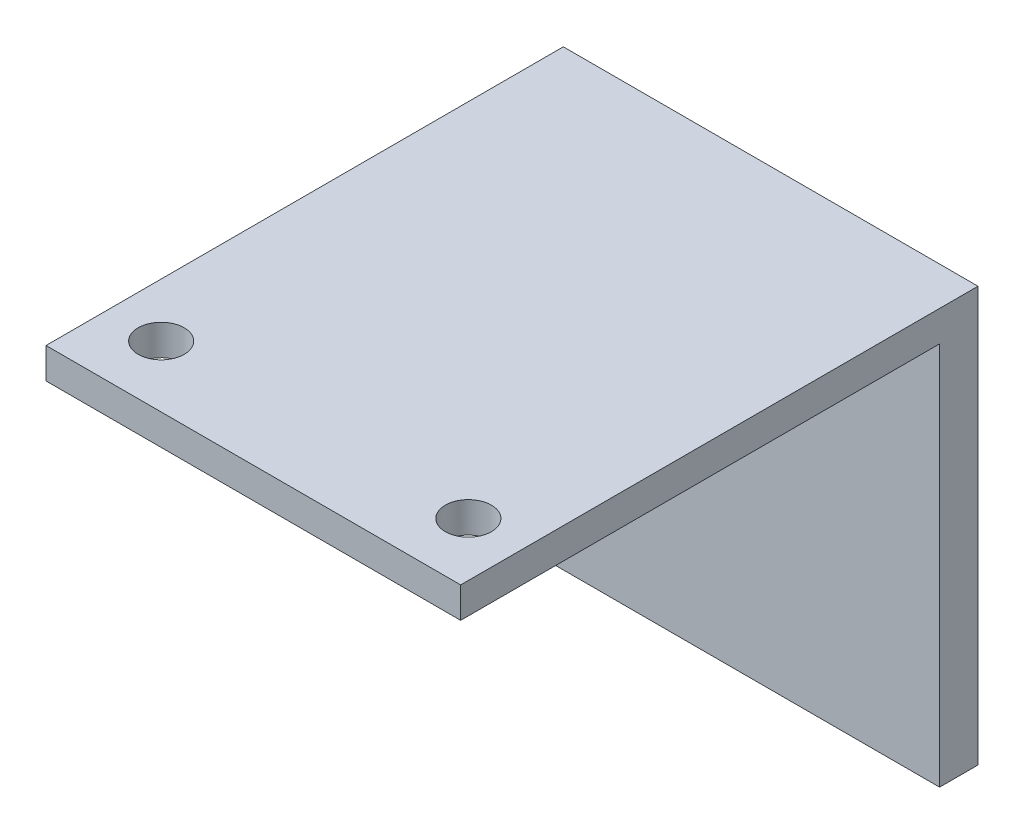
ISO-10303-21;
HEADER;
FILE_DESCRIPTION(('STEP AP214'),'2;1');
FILE_NAME('part.step','',(''),(''),'','','');
FILE_SCHEMA(('AUTOMOTIVE_DESIGN { 1 0 10303 214 1 1 1 1 }'));
ENDSEC;
DATA;
#1=APPLICATION_CONTEXT('core data for automotive mechanical design processes');
#2=APPLICATION_PROTOCOL_DEFINITION('international standard','automotive_design',2000,#1);
#3=PRODUCT_CONTEXT('',#1,'mechanical');
#4=PRODUCT('Part','Part','',(#3));
#5=PRODUCT_RELATED_PRODUCT_CATEGORY('part','',(#4));
#6=PRODUCT_DEFINITION_FORMATION('','',#4);
#7=PRODUCT_DEFINITION_CONTEXT('part definition',#1,'design');
#8=PRODUCT_DEFINITION('design','',#6,#7);
#9=PRODUCT_DEFINITION_SHAPE('','',#8);
#10=(LENGTH_UNIT() NAMED_UNIT(*) SI_UNIT(.MILLI.,.METRE.));
#11=(NAMED_UNIT(*) PLANE_ANGLE_UNIT() SI_UNIT($,.RADIAN.));
#12=(NAMED_UNIT(*) SI_UNIT($,.STERADIAN.) SOLID_ANGLE_UNIT());
#13=UNCERTAINTY_MEASURE_WITH_UNIT(LENGTH_MEASURE(1.E-05),#10,'distance_accuracy_value','');
#14=(GEOMETRIC_REPRESENTATION_CONTEXT(3) GLOBAL_UNCERTAINTY_ASSIGNED_CONTEXT((#13)) GLOBAL_UNIT_ASSIGNED_CONTEXT((#10,
#11,#12)) REPRESENTATION_CONTEXT('',''));
#15=CARTESIAN_POINT('',(0.,0.,0.));
#16=DIRECTION('',(0.,0.,1.));
#17=DIRECTION('',(1.,0.,0.));
#18=AXIS2_PLACEMENT_3D('',#15,#16,#17);
#19=CARTESIAN_POINT('',(0.,-27.,67.37));
#20=DIRECTION('',(0.,1.,0.));
#21=DIRECTION('',(0.,0.,1.));
#22=AXIS2_PLACEMENT_3D('',#19,#20,#21);
#23=PLANE('',#22);
#24=DIRECTION('',(1.,0.,0.));
#25=VECTOR('',#24,1.);
#26=CARTESIAN_POINT('',(0.,-27.,5.));
#27=LINE('',#26,#25);
#28=CARTESIAN_POINT('',(-27.,-27.,5.));
#29=VERTEX_POINT('',#28);
#30=CARTESIAN_POINT('',(27.,-27.,5.));
#31=VERTEX_POINT('',#30);
#32=EDGE_CURVE('E137',#29,#31,#27,.T.);
#33=ORIENTED_EDGE('',*,*,#32,.F.);
#34=DIRECTION('',(0.,0.,-1.));
#35=VECTOR('',#34,1.);
#36=CARTESIAN_POINT('',(-27.,-27.,67.37));
#37=LINE('',#36,#35);
#38=CARTESIAN_POINT('',(-27.,-27.,0.));
#39=VERTEX_POINT('',#38);
#40=EDGE_CURVE('E144',#29,#39,#37,.T.);
#41=ORIENTED_EDGE('',*,*,#40,.T.);
#42=DIRECTION('',(1.,0.,0.));
#43=VECTOR('',#42,1.);
#44=CARTESIAN_POINT('',(0.,-27.,0.));
#45=LINE('',#44,#43);
#46=CARTESIAN_POINT('',(27.,-27.,0.));
#47=VERTEX_POINT('',#46);
#48=EDGE_CURVE('E128',#39,#47,#45,.T.);
#49=ORIENTED_EDGE('',*,*,#48,.T.);
#50=DIRECTION('',(0.,0.,-1.));
#51=VECTOR('',#50,1.);
#52=CARTESIAN_POINT('',(27.,-27.,67.37));
#53=LINE('',#52,#51);
#54=EDGE_CURVE('E118',#31,#47,#53,.T.);
#55=ORIENTED_EDGE('',*,*,#54,.F.);
#56=EDGE_LOOP('',(#33,#41,#49,#55));
#57=FACE_BOUND('',#56,.T.);
#58=ADVANCED_FACE('F65',(#57),#23,.F.);
#59=CARTESIAN_POINT('',(-27.,0.,67.37));
#60=DIRECTION('',(-1.,0.,0.));
#61=DIRECTION('',(0.,0.,1.));
#62=AXIS2_PLACEMENT_3D('',#59,#60,#61);
#63=PLANE('',#62);
#64=DIRECTION('',(0.,0.,-1.));
#65=VECTOR('',#64,1.);
#66=CARTESIAN_POINT('',(-27.,23.,67.37));
#67=LINE('',#66,#65);
#68=CARTESIAN_POINT('',(-27.,23.,67.37));
#69=VERTEX_POINT('',#68);
#70=CARTESIAN_POINT('',(-27.,23.,5.));
#71=VERTEX_POINT('',#70);
#72=EDGE_CURVE('E177',#69,#71,#67,.T.);
#73=ORIENTED_EDGE('',*,*,#72,.F.);
#74=DIRECTION('',(0.,1.,0.));
#75=VECTOR('',#74,1.);
#76=CARTESIAN_POINT('',(-27.,0.,67.37));
#77=LINE('',#76,#75);
#78=CARTESIAN_POINT('',(-27.,27.,67.37));
#79=VERTEX_POINT('',#78);
#80=EDGE_CURVE('E182',#69,#79,#77,.T.);
#81=ORIENTED_EDGE('',*,*,#80,.T.);
#82=DIRECTION('',(0.,0.,-1.));
#83=VECTOR('',#82,1.);
#84=CARTESIAN_POINT('',(-27.,27.,67.37));
#85=LINE('',#84,#83);
#86=CARTESIAN_POINT('',(-27.,27.,0.));
#87=VERTEX_POINT('',#86);
#88=EDGE_CURVE('E146',#79,#87,#85,.T.);
#89=ORIENTED_EDGE('',*,*,#88,.T.);
#90=DIRECTION('',(0.,1.,0.));
#91=VECTOR('',#90,1.);
#92=CARTESIAN_POINT('',(-27.,0.,0.));
#93=LINE('',#92,#91);
#94=EDGE_CURVE('E132',#39,#87,#93,.T.);
#95=ORIENTED_EDGE('',*,*,#94,.F.);
#96=ORIENTED_EDGE('',*,*,#40,.F.);
#97=DIRECTION('',(0.,1.,0.));
#98=VECTOR('',#97,1.);
#99=CARTESIAN_POINT('',(-27.,0.,5.));
#100=LINE('',#99,#98);
#101=EDGE_CURVE('E133',#29,#71,#100,.T.);
#102=ORIENTED_EDGE('',*,*,#101,.T.);
#103=EDGE_LOOP('',(#73,#81,#89,#95,#96,#102));
#104=FACE_BOUND('',#103,.T.);
#105=ADVANCED_FACE('F186',(#104),#63,.T.);
#106=CARTESIAN_POINT('',(27.,0.,67.37));
#107=DIRECTION('',(-1.,0.,0.));
#108=DIRECTION('',(0.,0.,1.));
#109=AXIS2_PLACEMENT_3D('',#106,#107,#108);
#110=PLANE('',#109);
#111=DIRECTION('',(0.,1.,0.));
#112=VECTOR('',#111,1.);
#113=CARTESIAN_POINT('',(27.,0.,67.37));
#114=LINE('',#113,#112);
#115=CARTESIAN_POINT('',(27.,23.,67.37));
#116=VERTEX_POINT('',#115);
#117=CARTESIAN_POINT('',(27.,27.,67.37));
#118=VERTEX_POINT('',#117);
#119=EDGE_CURVE('E90',#116,#118,#114,.T.);
#120=ORIENTED_EDGE('',*,*,#119,.F.);
#121=DIRECTION('',(0.,0.,-1.));
#122=VECTOR('',#121,1.);
#123=CARTESIAN_POINT('',(27.,23.,67.37));
#124=LINE('',#123,#122);
#125=CARTESIAN_POINT('',(27.,23.,5.));
#126=VERTEX_POINT('',#125);
#127=EDGE_CURVE('E82',#116,#126,#124,.T.);
#128=ORIENTED_EDGE('',*,*,#127,.T.);
#129=DIRECTION('',(0.,1.,0.));
#130=VECTOR('',#129,1.);
#131=CARTESIAN_POINT('',(27.,0.,5.));
#132=LINE('',#131,#130);
#133=EDGE_CURVE('E12',#31,#126,#132,.T.);
#134=ORIENTED_EDGE('',*,*,#133,.F.);
#135=ORIENTED_EDGE('',*,*,#54,.T.);
#136=DIRECTION('',(0.,1.,0.));
#137=VECTOR('',#136,1.);
#138=CARTESIAN_POINT('',(27.,0.,0.));
#139=LINE('',#138,#137);
#140=CARTESIAN_POINT('',(27.,27.,0.));
#141=VERTEX_POINT('',#140);
#142=EDGE_CURVE('E121',#47,#141,#139,.T.);
#143=ORIENTED_EDGE('',*,*,#142,.T.);
#144=DIRECTION('',(0.,0.,-1.));
#145=VECTOR('',#144,1.);
#146=CARTESIAN_POINT('',(27.,27.,67.37));
#147=LINE('',#146,#145);
#148=EDGE_CURVE('E110',#118,#141,#147,.T.);
#149=ORIENTED_EDGE('',*,*,#148,.F.);
#150=EDGE_LOOP('',(#120,#128,#134,#135,#143,#149));
#151=FACE_BOUND('',#150,.T.);
#152=ADVANCED_FACE('F122',(#151),#110,.F.);
#153=CARTESIAN_POINT('',(0.,27.,67.37));
#154=DIRECTION('',(0.,1.,0.));
#155=DIRECTION('',(0.,0.,1.));
#156=AXIS2_PLACEMENT_3D('',#153,#154,#155);
#157=PLANE('',#156);
#158=CARTESIAN_POINT('',(20.,27.,59.37));
#159=DIRECTION('',(0.,1.,0.));
#160=DIRECTION('',(0.,0.,1.));
#161=AXIS2_PLACEMENT_3D('',#158,#159,#160);
#162=CIRCLE('',#161,3.);
#163=CARTESIAN_POINT('',(20.,27.,62.37));
#164=VERTEX_POINT('',#163);
#165=EDGE_CURVE('E155',#164,#164,#162,.T.);
#166=ORIENTED_EDGE('',*,*,#165,.F.);
#167=EDGE_LOOP('',(#166));
#168=FACE_BOUND('',#167,.T.);
#169=CARTESIAN_POINT('',(-20.,27.,59.37));
#170=DIRECTION('',(0.,1.,0.));
#171=DIRECTION('',(0.,0.,1.));
#172=AXIS2_PLACEMENT_3D('',#169,#170,#171);
#173=CIRCLE('',#172,3.);
#174=CARTESIAN_POINT('',(-20.,27.,62.37));
#175=VERTEX_POINT('',#174);
#176=EDGE_CURVE('E170',#175,#175,#173,.T.);
#177=ORIENTED_EDGE('',*,*,#176,.F.);
#178=EDGE_LOOP('',(#177));
#179=FACE_BOUND('',#178,.T.);
#180=DIRECTION('',(1.,0.,0.));
#181=VECTOR('',#180,1.);
#182=CARTESIAN_POINT('',(0.,27.,0.));
#183=LINE('',#182,#181);
#184=EDGE_CURVE('E114',#87,#141,#183,.T.);
#185=ORIENTED_EDGE('',*,*,#184,.F.);
#186=ORIENTED_EDGE('',*,*,#88,.F.);
#187=DIRECTION('',(1.,0.,0.));
#188=VECTOR('',#187,1.);
#189=CARTESIAN_POINT('',(0.,27.,67.37));
#190=LINE('',#189,#188);
#191=EDGE_CURVE('E116',#79,#118,#190,.T.);
#192=ORIENTED_EDGE('',*,*,#191,.T.);
#193=ORIENTED_EDGE('',*,*,#148,.T.);
#194=EDGE_LOOP('',(#185,#186,#192,#193));
#195=FACE_BOUND('',#194,.T.);
#196=ADVANCED_FACE('F67',(#168,#179,#195),#157,.T.);
#197=CARTESIAN_POINT('',(0.,0.,0.));
#198=DIRECTION('',(0.,0.,1.));
#199=DIRECTION('',(1.,0.,0.));
#200=AXIS2_PLACEMENT_3D('',#197,#198,#199);
#201=PLANE('',#200);
#202=CARTESIAN_POINT('',(-20.5628173044252,-15.5,0.));
#203=DIRECTION('',(0.,0.,-1.));
#204=DIRECTION('',(-1.,0.,0.));
#205=AXIS2_PLACEMENT_3D('',#202,#203,#204);
#206=CIRCLE('',#205,3.29999999999999);
#207=CARTESIAN_POINT('',(-23.8628173044252,-15.5,0.));
#208=VERTEX_POINT('',#207);
#209=EDGE_CURVE('E162',#208,#208,#206,.T.);
#210=ORIENTED_EDGE('',*,*,#209,.F.);
#211=EDGE_LOOP('',(#210));
#212=FACE_BOUND('',#211,.T.);
#213=CARTESIAN_POINT('',(-20.5628173044252,16.5,0.));
#214=DIRECTION('',(0.,0.,-1.));
#215=DIRECTION('',(-1.,0.,0.));
#216=AXIS2_PLACEMENT_3D('',#213,#214,#215);
#217=CIRCLE('',#216,3.29999999999999);
#218=CARTESIAN_POINT('',(-23.8628173044252,16.5,0.));
#219=VERTEX_POINT('',#218);
#220=EDGE_CURVE('E151',#219,#219,#217,.T.);
#221=ORIENTED_EDGE('',*,*,#220,.F.);
#222=EDGE_LOOP('',(#221));
#223=FACE_BOUND('',#222,.T.);
#224=ORIENTED_EDGE('',*,*,#184,.T.);
#225=ORIENTED_EDGE('',*,*,#142,.F.);
#226=ORIENTED_EDGE('',*,*,#48,.F.);
#227=ORIENTED_EDGE('',*,*,#94,.T.);
#228=EDGE_LOOP('',(#224,#225,#226,#227));
#229=FACE_BOUND('',#228,.T.);
#230=ADVANCED_FACE('F130',(#212,#223,#229),#201,.F.);
#231=CARTESIAN_POINT('',(0.,0.,67.37));
#232=DIRECTION('',(0.,0.,1.));
#233=DIRECTION('',(1.,0.,0.));
#234=AXIS2_PLACEMENT_3D('',#231,#232,#233);
#235=PLANE('',#234);
#236=DIRECTION('',(-1.,0.,0.));
#237=VECTOR('',#236,1.);
#238=CARTESIAN_POINT('',(0.,23.,67.37));
#239=LINE('',#238,#237);
#240=EDGE_CURVE('E74',#116,#69,#239,.T.);
#241=ORIENTED_EDGE('',*,*,#240,.F.);
#242=ORIENTED_EDGE('',*,*,#119,.T.);
#243=ORIENTED_EDGE('',*,*,#191,.F.);
#244=ORIENTED_EDGE('',*,*,#80,.F.);
#245=EDGE_LOOP('',(#241,#242,#243,#244));
#246=FACE_BOUND('',#245,.T.);
#247=ADVANCED_FACE('F188',(#246),#235,.T.);
#248=CARTESIAN_POINT('',(38.7750425347235,23.,5.));
#249=DIRECTION('',(0.,1.,0.));
#250=DIRECTION('',(0.,0.,1.));
#251=AXIS2_PLACEMENT_3D('',#248,#249,#250);
#252=PLANE('',#251);
#253=CARTESIAN_POINT('',(20.,23.,59.37));
#254=DIRECTION('',(0.,-1.,0.));
#255=DIRECTION('',(0.,0.,-1.));
#256=AXIS2_PLACEMENT_3D('',#253,#254,#255);
#257=CIRCLE('',#256,3.);
#258=CARTESIAN_POINT('',(20.,23.,56.37));
#259=VERTEX_POINT('',#258);
#260=EDGE_CURVE('E150',#259,#259,#257,.T.);
#261=ORIENTED_EDGE('',*,*,#260,.F.);
#262=EDGE_LOOP('',(#261));
#263=FACE_BOUND('',#262,.T.);
#264=CARTESIAN_POINT('',(-20.,23.,59.37));
#265=DIRECTION('',(0.,-1.,0.));
#266=DIRECTION('',(0.,0.,-1.));
#267=AXIS2_PLACEMENT_3D('',#264,#265,#266);
#268=CIRCLE('',#267,3.);
#269=CARTESIAN_POINT('',(-20.,23.,56.37));
#270=VERTEX_POINT('',#269);
#271=EDGE_CURVE('E167',#270,#270,#268,.T.);
#272=ORIENTED_EDGE('',*,*,#271,.F.);
#273=EDGE_LOOP('',(#272));
#274=FACE_BOUND('',#273,.T.);
#275=ORIENTED_EDGE('',*,*,#72,.T.);
#276=DIRECTION('',(-1.,0.,0.));
#277=VECTOR('',#276,1.);
#278=CARTESIAN_POINT('',(38.7750425347235,23.,5.));
#279=LINE('',#278,#277);
#280=EDGE_CURVE('E173',#126,#71,#279,.T.);
#281=ORIENTED_EDGE('',*,*,#280,.F.);
#282=ORIENTED_EDGE('',*,*,#127,.F.);
#283=ORIENTED_EDGE('',*,*,#240,.T.);
#284=EDGE_LOOP('',(#275,#281,#282,#283));
#285=FACE_BOUND('',#284,.T.);
#286=ADVANCED_FACE('F190',(#263,#274,#285),#252,.F.);
#287=CARTESIAN_POINT('',(0.,0.,5.));
#288=DIRECTION('',(0.,0.,1.));
#289=DIRECTION('',(1.,0.,0.));
#290=AXIS2_PLACEMENT_3D('',#287,#288,#289);
#291=PLANE('',#290);
#292=CARTESIAN_POINT('',(-20.5628173044252,-15.5,5.));
#293=DIRECTION('',(0.,0.,1.));
#294=DIRECTION('',(1.,0.,0.));
#295=AXIS2_PLACEMENT_3D('',#292,#293,#294);
#296=CIRCLE('',#295,3.29999999999999);
#297=CARTESIAN_POINT('',(-17.2628173044252,-15.5,5.));
#298=VERTEX_POINT('',#297);
#299=EDGE_CURVE('E69',#298,#298,#296,.T.);
#300=ORIENTED_EDGE('',*,*,#299,.F.);
#301=EDGE_LOOP('',(#300));
#302=FACE_BOUND('',#301,.T.);
#303=CARTESIAN_POINT('',(-20.5628173044252,16.5,5.));
#304=DIRECTION('',(0.,0.,1.));
#305=DIRECTION('',(1.,0.,0.));
#306=AXIS2_PLACEMENT_3D('',#303,#304,#305);
#307=CIRCLE('',#306,3.29999999999999);
#308=CARTESIAN_POINT('',(-17.2628173044252,16.5,5.));
#309=VERTEX_POINT('',#308);
#310=EDGE_CURVE('E148',#309,#309,#307,.T.);
#311=ORIENTED_EDGE('',*,*,#310,.F.);
#312=EDGE_LOOP('',(#311));
#313=FACE_BOUND('',#312,.T.);
#314=ORIENTED_EDGE('',*,*,#32,.T.);
#315=ORIENTED_EDGE('',*,*,#133,.T.);
#316=ORIENTED_EDGE('',*,*,#280,.T.);
#317=ORIENTED_EDGE('',*,*,#101,.F.);
#318=EDGE_LOOP('',(#314,#315,#316,#317));
#319=FACE_BOUND('',#318,.T.);
#320=ADVANCED_FACE('F196',(#302,#313,#319),#291,.T.);
#321=CARTESIAN_POINT('',(-20.,85.37,59.37));
#322=DIRECTION('',(0.,-1.,0.));
#323=DIRECTION('',(0.,0.,-1.));
#324=AXIS2_PLACEMENT_3D('',#321,#322,#323);
#325=CYLINDRICAL_SURFACE('',#324,3.);
#326=ORIENTED_EDGE('',*,*,#176,.T.);
#327=EDGE_LOOP('',(#326));
#328=FACE_BOUND('',#327,.T.);
#329=ORIENTED_EDGE('',*,*,#271,.T.);
#330=EDGE_LOOP('',(#329));
#331=FACE_BOUND('',#330,.T.);
#332=ADVANCED_FACE('F221',(#328,#331),#325,.F.);
#333=CARTESIAN_POINT('',(20.,85.37,59.37));
#334=DIRECTION('',(0.,-1.,0.));
#335=DIRECTION('',(0.,0.,-1.));
#336=AXIS2_PLACEMENT_3D('',#333,#334,#335);
#337=CYLINDRICAL_SURFACE('',#336,3.);
#338=ORIENTED_EDGE('',*,*,#165,.T.);
#339=EDGE_LOOP('',(#338));
#340=FACE_BOUND('',#339,.T.);
#341=ORIENTED_EDGE('',*,*,#260,.T.);
#342=EDGE_LOOP('',(#341));
#343=FACE_BOUND('',#342,.T.);
#344=ADVANCED_FACE('F224',(#340,#343),#337,.F.);
#345=CARTESIAN_POINT('',(-20.5628173044252,16.5,0.));
#346=DIRECTION('',(0.,0.,-1.));
#347=DIRECTION('',(-1.,0.,0.));
#348=AXIS2_PLACEMENT_3D('',#345,#346,#347);
#349=CYLINDRICAL_SURFACE('',#348,3.29999999999999);
#350=ORIENTED_EDGE('',*,*,#310,.T.);
#351=EDGE_LOOP('',(#350));
#352=FACE_BOUND('',#351,.T.);
#353=ORIENTED_EDGE('',*,*,#220,.T.);
#354=EDGE_LOOP('',(#353));
#355=FACE_BOUND('',#354,.T.);
#356=ADVANCED_FACE('F249',(#352,#355),#349,.F.);
#357=CARTESIAN_POINT('',(-20.5628173044252,-15.5,0.));
#358=DIRECTION('',(0.,0.,-1.));
#359=DIRECTION('',(-1.,0.,0.));
#360=AXIS2_PLACEMENT_3D('',#357,#358,#359);
#361=CYLINDRICAL_SURFACE('',#360,3.29999999999999);
#362=ORIENTED_EDGE('',*,*,#299,.T.);
#363=EDGE_LOOP('',(#362));
#364=FACE_BOUND('',#363,.T.);
#365=ORIENTED_EDGE('',*,*,#209,.T.);
#366=EDGE_LOOP('',(#365));
#367=FACE_BOUND('',#366,.T.);
#368=ADVANCED_FACE('F253',(#364,#367),#361,.F.);
#369=CLOSED_SHELL('',(#58,#105,#152,#196,#230,#247,#286,#320,#332,#344,#356,#368));
#370=MANIFOLD_SOLID_BREP('B2',#369);
#371=ADVANCED_BREP_SHAPE_REPRESENTATION('',(#18,#370),#14);
#372=SHAPE_DEFINITION_REPRESENTATION(#9,#371);
ENDSEC;
END-ISO-10303-21;
